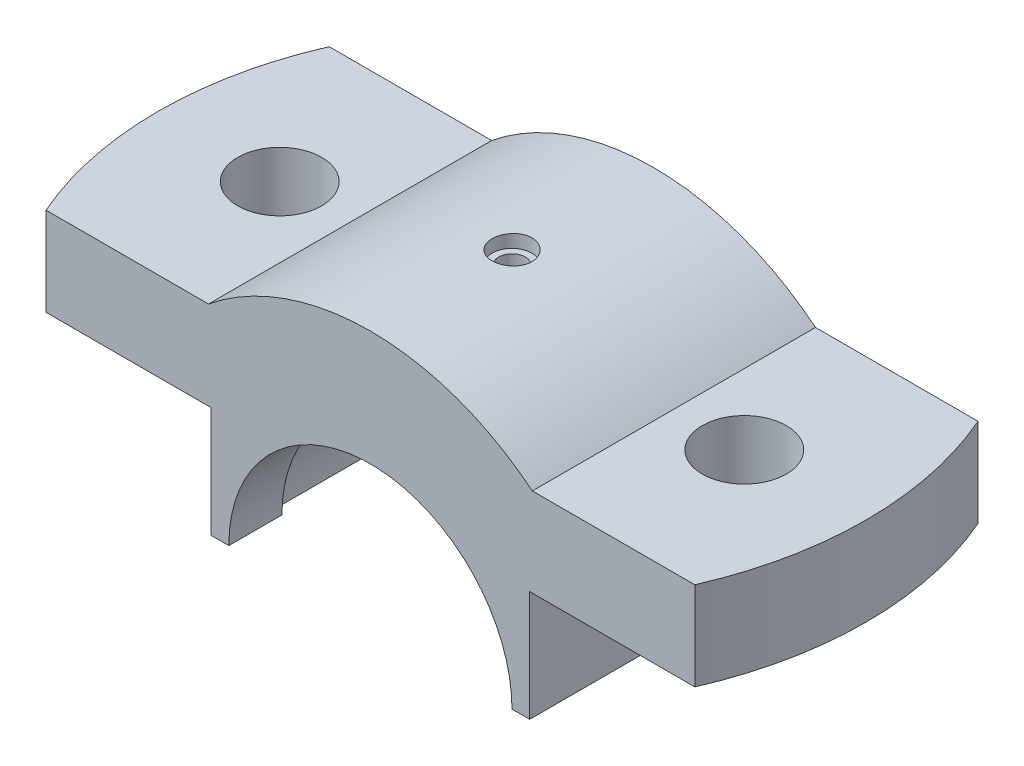
ISO-10303-21;
HEADER;
FILE_DESCRIPTION(('STEP AP214'),'2;1');
FILE_NAME('part.step','',(''),(''),'','','');
FILE_SCHEMA(('AUTOMOTIVE_DESIGN { 1 0 10303 214 1 1 1 1 }'));
ENDSEC;
DATA;
#1=APPLICATION_CONTEXT('core data for automotive mechanical design processes');
#2=APPLICATION_PROTOCOL_DEFINITION('international standard','automotive_design',2000,#1);
#3=PRODUCT_CONTEXT('',#1,'mechanical');
#4=PRODUCT('Part','Part','',(#3));
#5=PRODUCT_RELATED_PRODUCT_CATEGORY('part','',(#4));
#6=PRODUCT_DEFINITION_FORMATION('','',#4);
#7=PRODUCT_DEFINITION_CONTEXT('part definition',#1,'design');
#8=PRODUCT_DEFINITION('design','',#6,#7);
#9=PRODUCT_DEFINITION_SHAPE('','',#8);
#10=(LENGTH_UNIT() NAMED_UNIT(*) SI_UNIT(.MILLI.,.METRE.));
#11=(NAMED_UNIT(*) PLANE_ANGLE_UNIT() SI_UNIT($,.RADIAN.));
#12=(NAMED_UNIT(*) SI_UNIT($,.STERADIAN.) SOLID_ANGLE_UNIT());
#13=UNCERTAINTY_MEASURE_WITH_UNIT(LENGTH_MEASURE(1.E-05),#10,'distance_accuracy_value','');
#14=(GEOMETRIC_REPRESENTATION_CONTEXT(3) GLOBAL_UNCERTAINTY_ASSIGNED_CONTEXT((#13)) GLOBAL_UNIT_ASSIGNED_CONTEXT((#10,
#11,#12)) REPRESENTATION_CONTEXT('',''));
#15=CARTESIAN_POINT('',(0.,0.,0.));
#16=DIRECTION('',(0.,0.,1.));
#17=DIRECTION('',(1.,0.,0.));
#18=AXIS2_PLACEMENT_3D('',#15,#16,#17);
#19=CARTESIAN_POINT('',(-80.,45.,32.));
#20=DIRECTION('',(0.,1.,0.));
#21=DIRECTION('',(-1.,0.,0.));
#22=AXIS2_PLACEMENT_3D('',#19,#20,#21);
#23=PLANE('',#22);
#24=CARTESIAN_POINT('',(-52.5,45.,0.));
#25=DIRECTION('',(0.,-1.,0.));
#26=DIRECTION('',(1.,0.,0.));
#27=AXIS2_PLACEMENT_3D('',#24,#25,#26);
#28=CIRCLE('',#27,9.49999999999999);
#29=CARTESIAN_POINT('',(-62.,45.,0.));
#30=VERTEX_POINT('',#29);
#31=EDGE_CURVE('E173',#30,#30,#28,.T.);
#32=ORIENTED_EDGE('',*,*,#31,.T.);
#33=EDGE_LOOP('',(#32));
#34=FACE_BOUND('',#33,.T.);
#35=CARTESIAN_POINT('',(0.,45.,0.));
#36=DIRECTION('',(0.,-1.,0.));
#37=DIRECTION('',(1.,0.,0.));
#38=AXIS2_PLACEMENT_3D('',#35,#36,#37);
#39=CIRCLE('',#38,80.);
#40=CARTESIAN_POINT('',(-73.3212111192935,45.,32.));
#41=VERTEX_POINT('',#40);
#42=CARTESIAN_POINT('',(-73.3212111192935,45.,-32.));
#43=VERTEX_POINT('',#42);
#44=EDGE_CURVE('E154',#41,#43,#39,.T.);
#45=ORIENTED_EDGE('',*,*,#44,.F.);
#46=DIRECTION('',(1.,0.,0.));
#47=VECTOR('',#46,1.);
#48=CARTESIAN_POINT('',(-80.,45.,32.));
#49=LINE('',#48,#47);
#50=CARTESIAN_POINT('',(-36.592348927064,45.,32.));
#51=VERTEX_POINT('',#50);
#52=EDGE_CURVE('E158',#41,#51,#49,.T.);
#53=ORIENTED_EDGE('',*,*,#52,.T.);
#54=DIRECTION('',(0.,0.,-1.));
#55=VECTOR('',#54,1.);
#56=CARTESIAN_POINT('',(-36.592348927064,45.,32.));
#57=LINE('',#56,#55);
#58=CARTESIAN_POINT('',(-36.592348927064,45.,-32.));
#59=VERTEX_POINT('',#58);
#60=EDGE_CURVE('E209',#51,#59,#57,.T.);
#61=ORIENTED_EDGE('',*,*,#60,.T.);
#62=DIRECTION('',(1.,0.,0.));
#63=VECTOR('',#62,1.);
#64=CARTESIAN_POINT('',(-80.,45.,-32.));
#65=LINE('',#64,#63);
#66=EDGE_CURVE('E160',#43,#59,#65,.T.);
#67=ORIENTED_EDGE('',*,*,#66,.F.);
#68=EDGE_LOOP('',(#45,#53,#61,#67));
#69=FACE_BOUND('',#68,.T.);
#70=ADVANCED_FACE('F39',(#34,#69),#23,.T.);
#71=CARTESIAN_POINT('',(-36.,25.,32.));
#72=DIRECTION('',(0.,-1.,0.));
#73=DIRECTION('',(0.,0.,-1.));
#74=AXIS2_PLACEMENT_3D('',#71,#72,#73);
#75=PLANE('',#74);
#76=CARTESIAN_POINT('',(-52.5,25.,0.));
#77=DIRECTION('',(0.,-1.,0.));
#78=DIRECTION('',(0.,0.,-1.));
#79=AXIS2_PLACEMENT_3D('',#76,#77,#78);
#80=CIRCLE('',#79,9.49999999999999);
#81=CARTESIAN_POINT('',(-62.,25.,0.));
#82=VERTEX_POINT('',#81);
#83=EDGE_CURVE('E197',#82,#82,#80,.F.);
#84=ORIENTED_EDGE('',*,*,#83,.T.);
#85=EDGE_LOOP('',(#84));
#86=FACE_BOUND('',#85,.T.);
#87=CARTESIAN_POINT('',(0.,25.,0.));
#88=DIRECTION('',(0.,-1.,0.));
#89=DIRECTION('',(0.,0.,-1.));
#90=AXIS2_PLACEMENT_3D('',#87,#88,#89);
#91=CIRCLE('',#90,80.);
#92=CARTESIAN_POINT('',(-73.3212111192935,25.,-32.));
#93=VERTEX_POINT('',#92);
#94=CARTESIAN_POINT('',(-73.3212111192935,25.,32.));
#95=VERTEX_POINT('',#94);
#96=EDGE_CURVE('E48',#93,#95,#91,.F.);
#97=ORIENTED_EDGE('',*,*,#96,.F.);
#98=DIRECTION('',(-1.,0.,0.));
#99=VECTOR('',#98,1.);
#100=CARTESIAN_POINT('',(-36.,25.,-32.));
#101=LINE('',#100,#99);
#102=CARTESIAN_POINT('',(-36.,25.,-32.));
#103=VERTEX_POINT('',#102);
#104=EDGE_CURVE('E196',#103,#93,#101,.T.);
#105=ORIENTED_EDGE('',*,*,#104,.F.);
#106=DIRECTION('',(0.,0.,-1.));
#107=VECTOR('',#106,1.);
#108=CARTESIAN_POINT('',(-36.,25.,32.));
#109=LINE('',#108,#107);
#110=CARTESIAN_POINT('',(-36.,25.,32.));
#111=VERTEX_POINT('',#110);
#112=EDGE_CURVE('E207',#111,#103,#109,.T.);
#113=ORIENTED_EDGE('',*,*,#112,.F.);
#114=DIRECTION('',(-1.,0.,0.));
#115=VECTOR('',#114,1.);
#116=CARTESIAN_POINT('',(-36.,25.,32.));
#117=LINE('',#116,#115);
#118=EDGE_CURVE('E179',#111,#95,#117,.T.);
#119=ORIENTED_EDGE('',*,*,#118,.T.);
#120=EDGE_LOOP('',(#97,#105,#113,#119));
#121=FACE_BOUND('',#120,.T.);
#122=ADVANCED_FACE('F325',(#86,#121),#75,.T.);
#123=CARTESIAN_POINT('',(0.,0.,32.));
#124=DIRECTION('',(0.,0.,-1.));
#125=DIRECTION('',(-1.,0.,0.));
#126=AXIS2_PLACEMENT_3D('',#123,#124,#125);
#127=CYLINDRICAL_SURFACE('',#126,32.);
#128=CARTESIAN_POINT('',(0.,0.,-20.));
#129=DIRECTION('',(0.,0.,1.));
#130=DIRECTION('',(1.,0.,0.));
#131=AXIS2_PLACEMENT_3D('',#128,#129,#130);
#132=CIRCLE('',#131,32.);
#133=CARTESIAN_POINT('',(-32.,0.,-20.));
#134=VERTEX_POINT('',#133);
#135=CARTESIAN_POINT('',(32.,0.,-20.));
#136=VERTEX_POINT('',#135);
#137=EDGE_CURVE('E225',#134,#136,#132,.F.);
#138=ORIENTED_EDGE('',*,*,#137,.F.);
#139=DIRECTION('',(0.,0.,-1.));
#140=VECTOR('',#139,1.);
#141=CARTESIAN_POINT('',(-32.,0.,32.));
#142=LINE('',#141,#140);
#143=CARTESIAN_POINT('',(-32.,0.,-32.));
#144=VERTEX_POINT('',#143);
#145=EDGE_CURVE('E194',#134,#144,#142,.T.);
#146=ORIENTED_EDGE('',*,*,#145,.T.);
#147=CARTESIAN_POINT('',(0.,0.,-32.));
#148=DIRECTION('',(0.,0.,-1.));
#149=DIRECTION('',(1.,0.,0.));
#150=AXIS2_PLACEMENT_3D('',#147,#148,#149);
#151=CIRCLE('',#150,32.);
#152=CARTESIAN_POINT('',(32.,0.,-32.));
#153=VERTEX_POINT('',#152);
#154=EDGE_CURVE('E238',#144,#153,#151,.T.);
#155=ORIENTED_EDGE('',*,*,#154,.T.);
#156=DIRECTION('',(0.,0.,-1.));
#157=VECTOR('',#156,1.);
#158=CARTESIAN_POINT('',(32.,0.,32.));
#159=LINE('',#158,#157);
#160=EDGE_CURVE('E275',#136,#153,#159,.T.);
#161=ORIENTED_EDGE('',*,*,#160,.F.);
#162=EDGE_LOOP('',(#138,#146,#155,#161));
#163=FACE_BOUND('',#162,.T.);
#164=ADVANCED_FACE('F319',(#163),#127,.F.);
#165=CARTESIAN_POINT('',(-32.,0.,32.));
#166=DIRECTION('',(0.,-1.,0.));
#167=DIRECTION('',(0.,0.,-1.));
#168=AXIS2_PLACEMENT_3D('',#165,#166,#167);
#169=PLANE('',#168);
#170=ORIENTED_EDGE('',*,*,#145,.F.);
#171=DIRECTION('',(-1.,0.,0.));
#172=VECTOR('',#171,1.);
#173=CARTESIAN_POINT('',(-32.,0.,-20.));
#174=LINE('',#173,#172);
#175=CARTESIAN_POINT('',(-34.,0.,-20.));
#176=VERTEX_POINT('',#175);
#177=EDGE_CURVE('E288',#134,#176,#174,.T.);
#178=ORIENTED_EDGE('',*,*,#177,.T.);
#179=DIRECTION('',(0.,0.,1.));
#180=VECTOR('',#179,1.);
#181=CARTESIAN_POINT('',(-34.,0.,-20.));
#182=LINE('',#181,#180);
#183=CARTESIAN_POINT('',(-34.,0.,20.));
#184=VERTEX_POINT('',#183);
#185=EDGE_CURVE('E285',#176,#184,#182,.T.);
#186=ORIENTED_EDGE('',*,*,#185,.T.);
#187=DIRECTION('',(-1.,0.,0.));
#188=VECTOR('',#187,1.);
#189=CARTESIAN_POINT('',(-32.,0.,20.));
#190=LINE('',#189,#188);
#191=CARTESIAN_POINT('',(-32.,0.,20.));
#192=VERTEX_POINT('',#191);
#193=EDGE_CURVE('E281',#192,#184,#190,.T.);
#194=ORIENTED_EDGE('',*,*,#193,.F.);
#195=CARTESIAN_POINT('',(-32.,0.,32.));
#196=VERTEX_POINT('',#195);
#197=EDGE_CURVE('E202',#196,#192,#142,.T.);
#198=ORIENTED_EDGE('',*,*,#197,.F.);
#199=DIRECTION('',(-1.,0.,0.));
#200=VECTOR('',#199,1.);
#201=CARTESIAN_POINT('',(-32.,0.,32.));
#202=LINE('',#201,#200);
#203=CARTESIAN_POINT('',(-36.,0.,32.));
#204=VERTEX_POINT('',#203);
#205=EDGE_CURVE('E191',#196,#204,#202,.T.);
#206=ORIENTED_EDGE('',*,*,#205,.T.);
#207=DIRECTION('',(0.,0.,-1.));
#208=VECTOR('',#207,1.);
#209=CARTESIAN_POINT('',(-36.,0.,32.));
#210=LINE('',#209,#208);
#211=CARTESIAN_POINT('',(-36.,0.,-32.));
#212=VERTEX_POINT('',#211);
#213=EDGE_CURVE('E205',#204,#212,#210,.T.);
#214=ORIENTED_EDGE('',*,*,#213,.T.);
#215=DIRECTION('',(-1.,0.,0.));
#216=VECTOR('',#215,1.);
#217=CARTESIAN_POINT('',(-32.,0.,-32.));
#218=LINE('',#217,#216);
#219=EDGE_CURVE('E180',#144,#212,#218,.T.);
#220=ORIENTED_EDGE('',*,*,#219,.F.);
#221=EDGE_LOOP('',(#170,#178,#186,#194,#198,#206,#214,#220));
#222=FACE_BOUND('',#221,.T.);
#223=ADVANCED_FACE('F315',(#222),#169,.T.);
#224=CARTESIAN_POINT('',(36.,25.,32.));
#225=DIRECTION('',(0.,1.,0.));
#226=DIRECTION('',(0.,0.,1.));
#227=AXIS2_PLACEMENT_3D('',#224,#225,#226);
#228=PLANE('',#227);
#229=CARTESIAN_POINT('',(52.5,25.,0.));
#230=DIRECTION('',(0.,1.,0.));
#231=DIRECTION('',(0.,0.,1.));
#232=AXIS2_PLACEMENT_3D('',#229,#230,#231);
#233=CIRCLE('',#232,9.49999999999999);
#234=CARTESIAN_POINT('',(43.,25.,0.));
#235=VERTEX_POINT('',#234);
#236=EDGE_CURVE('E235',#235,#235,#233,.T.);
#237=ORIENTED_EDGE('',*,*,#236,.T.);
#238=EDGE_LOOP('',(#237));
#239=FACE_BOUND('',#238,.T.);
#240=CARTESIAN_POINT('',(0.,25.,0.));
#241=DIRECTION('',(0.,1.,0.));
#242=DIRECTION('',(0.,0.,1.));
#243=AXIS2_PLACEMENT_3D('',#240,#241,#242);
#244=CIRCLE('',#243,80.);
#245=CARTESIAN_POINT('',(73.3212111192935,25.,32.));
#246=VERTEX_POINT('',#245);
#247=CARTESIAN_POINT('',(73.3212111192935,25.,-32.));
#248=VERTEX_POINT('',#247);
#249=EDGE_CURVE('E63',#246,#248,#244,.T.);
#250=ORIENTED_EDGE('',*,*,#249,.F.);
#251=DIRECTION('',(1.,0.,0.));
#252=VECTOR('',#251,1.);
#253=CARTESIAN_POINT('',(36.,25.,32.));
#254=LINE('',#253,#252);
#255=CARTESIAN_POINT('',(36.,25.,32.));
#256=VERTEX_POINT('',#255);
#257=EDGE_CURVE('E247',#256,#246,#254,.T.);
#258=ORIENTED_EDGE('',*,*,#257,.F.);
#259=DIRECTION('',(0.,0.,-1.));
#260=VECTOR('',#259,1.);
#261=CARTESIAN_POINT('',(36.,25.,32.));
#262=LINE('',#261,#260);
#263=CARTESIAN_POINT('',(36.,25.,-32.));
#264=VERTEX_POINT('',#263);
#265=EDGE_CURVE('E269',#256,#264,#262,.T.);
#266=ORIENTED_EDGE('',*,*,#265,.T.);
#267=DIRECTION('',(1.,0.,0.));
#268=VECTOR('',#267,1.);
#269=CARTESIAN_POINT('',(36.,25.,-32.));
#270=LINE('',#269,#268);
#271=EDGE_CURVE('E260',#264,#248,#270,.T.);
#272=ORIENTED_EDGE('',*,*,#271,.T.);
#273=EDGE_LOOP('',(#250,#258,#266,#272));
#274=FACE_BOUND('',#273,.T.);
#275=ADVANCED_FACE('F318',(#239,#274),#228,.F.);
#276=CARTESIAN_POINT('',(80.,45.,32.));
#277=DIRECTION('',(0.,-1.,0.));
#278=DIRECTION('',(1.,0.,0.));
#279=AXIS2_PLACEMENT_3D('',#276,#277,#278);
#280=PLANE('',#279);
#281=CARTESIAN_POINT('',(52.5,45.,0.));
#282=DIRECTION('',(0.,1.,0.));
#283=DIRECTION('',(-1.,0.,0.));
#284=AXIS2_PLACEMENT_3D('',#281,#282,#283);
#285=CIRCLE('',#284,9.49999999999999);
#286=CARTESIAN_POINT('',(43.,45.,0.));
#287=VERTEX_POINT('',#286);
#288=EDGE_CURVE('E232',#287,#287,#285,.T.);
#289=ORIENTED_EDGE('',*,*,#288,.F.);
#290=EDGE_LOOP('',(#289));
#291=FACE_BOUND('',#290,.T.);
#292=CARTESIAN_POINT('',(0.,45.,0.));
#293=DIRECTION('',(0.,1.,0.));
#294=DIRECTION('',(-1.,0.,0.));
#295=AXIS2_PLACEMENT_3D('',#292,#293,#294);
#296=CIRCLE('',#295,80.);
#297=CARTESIAN_POINT('',(73.3212111192935,45.,32.));
#298=VERTEX_POINT('',#297);
#299=CARTESIAN_POINT('',(73.3212111192935,45.,-32.));
#300=VERTEX_POINT('',#299);
#301=EDGE_CURVE('E211',#298,#300,#296,.T.);
#302=ORIENTED_EDGE('',*,*,#301,.T.);
#303=DIRECTION('',(-1.,0.,0.));
#304=VECTOR('',#303,1.);
#305=CARTESIAN_POINT('',(80.,45.,-32.));
#306=LINE('',#305,#304);
#307=CARTESIAN_POINT('',(36.592348927064,45.,-32.));
#308=VERTEX_POINT('',#307);
#309=EDGE_CURVE('E263',#300,#308,#306,.T.);
#310=ORIENTED_EDGE('',*,*,#309,.T.);
#311=DIRECTION('',(0.,0.,-1.));
#312=VECTOR('',#311,1.);
#313=CARTESIAN_POINT('',(36.592348927064,45.,32.));
#314=LINE('',#313,#312);
#315=CARTESIAN_POINT('',(36.592348927064,45.,32.));
#316=VERTEX_POINT('',#315);
#317=EDGE_CURVE('E253',#316,#308,#314,.T.);
#318=ORIENTED_EDGE('',*,*,#317,.F.);
#319=DIRECTION('',(-1.,0.,0.));
#320=VECTOR('',#319,1.);
#321=CARTESIAN_POINT('',(80.,45.,32.));
#322=LINE('',#321,#320);
#323=EDGE_CURVE('E250',#298,#316,#322,.T.);
#324=ORIENTED_EDGE('',*,*,#323,.F.);
#325=EDGE_LOOP('',(#302,#310,#318,#324));
#326=FACE_BOUND('',#325,.T.);
#327=ADVANCED_FACE('F403',(#291,#326),#280,.F.);
#328=CARTESIAN_POINT('',(0.,0.,32.));
#329=DIRECTION('',(0.,0.,1.));
#330=DIRECTION('',(1.,0.,0.));
#331=AXIS2_PLACEMENT_3D('',#328,#329,#330);
#332=PLANE('',#331);
#333=DIRECTION('',(0.,1.,0.));
#334=VECTOR('',#333,1.);
#335=CARTESIAN_POINT('',(-73.3212111192935,4.99999999999999,32.));
#336=LINE('',#335,#334);
#337=EDGE_CURVE('E168',#95,#41,#336,.T.);
#338=ORIENTED_EDGE('',*,*,#337,.F.);
#339=ORIENTED_EDGE('',*,*,#118,.F.);
#340=DIRECTION('',(0.,1.,0.));
#341=VECTOR('',#340,1.);
#342=CARTESIAN_POINT('',(-36.,0.,32.));
#343=LINE('',#342,#341);
#344=EDGE_CURVE('E182',#204,#111,#343,.T.);
#345=ORIENTED_EDGE('',*,*,#344,.F.);
#346=ORIENTED_EDGE('',*,*,#205,.F.);
#347=CARTESIAN_POINT('',(0.,0.,32.));
#348=DIRECTION('',(0.,0.,-1.));
#349=DIRECTION('',(1.,0.,0.));
#350=AXIS2_PLACEMENT_3D('',#347,#348,#349);
#351=CIRCLE('',#350,32.);
#352=CARTESIAN_POINT('',(32.,0.,32.));
#353=VERTEX_POINT('',#352);
#354=EDGE_CURVE('E239',#196,#353,#351,.T.);
#355=ORIENTED_EDGE('',*,*,#354,.T.);
#356=DIRECTION('',(1.,0.,0.));
#357=VECTOR('',#356,1.);
#358=CARTESIAN_POINT('',(32.,0.,32.));
#359=LINE('',#358,#357);
#360=CARTESIAN_POINT('',(36.,0.,32.));
#361=VERTEX_POINT('',#360);
#362=EDGE_CURVE('E242',#353,#361,#359,.T.);
#363=ORIENTED_EDGE('',*,*,#362,.T.);
#364=DIRECTION('',(0.,1.,0.));
#365=VECTOR('',#364,1.);
#366=CARTESIAN_POINT('',(36.,0.,32.));
#367=LINE('',#366,#365);
#368=EDGE_CURVE('E245',#361,#256,#367,.T.);
#369=ORIENTED_EDGE('',*,*,#368,.T.);
#370=ORIENTED_EDGE('',*,*,#257,.T.);
#371=DIRECTION('',(0.,1.,0.));
#372=VECTOR('',#371,1.);
#373=CARTESIAN_POINT('',(73.3212111192935,4.99999999999999,32.));
#374=LINE('',#373,#372);
#375=EDGE_CURVE('E214',#246,#298,#374,.T.);
#376=ORIENTED_EDGE('',*,*,#375,.T.);
#377=ORIENTED_EDGE('',*,*,#323,.T.);
#378=CARTESIAN_POINT('',(0.,0.,32.));
#379=DIRECTION('',(0.,0.,1.));
#380=DIRECTION('',(1.,0.,0.));
#381=AXIS2_PLACEMENT_3D('',#378,#379,#380);
#382=CIRCLE('',#381,58.);
#383=EDGE_CURVE('E177',#316,#51,#382,.T.);
#384=ORIENTED_EDGE('',*,*,#383,.T.);
#385=ORIENTED_EDGE('',*,*,#52,.F.);
#386=EDGE_LOOP('',(#338,#339,#345,#346,#355,#363,#369,#370,#376,#377,#384,#385));
#387=FACE_BOUND('',#386,.T.);
#388=ADVANCED_FACE('F175',(#387),#332,.T.);
#389=CARTESIAN_POINT('',(0.,0.,-32.));
#390=DIRECTION('',(0.,0.,1.));
#391=DIRECTION('',(1.,0.,0.));
#392=AXIS2_PLACEMENT_3D('',#389,#390,#391);
#393=PLANE('',#392);
#394=ORIENTED_EDGE('',*,*,#104,.T.);
#395=DIRECTION('',(0.,1.,0.));
#396=VECTOR('',#395,1.);
#397=CARTESIAN_POINT('',(-73.3212111192935,4.99999999999999,-32.));
#398=LINE('',#397,#396);
#399=EDGE_CURVE('E164',#93,#43,#398,.T.);
#400=ORIENTED_EDGE('',*,*,#399,.T.);
#401=ORIENTED_EDGE('',*,*,#66,.T.);
#402=CARTESIAN_POINT('',(0.,0.,-32.));
#403=DIRECTION('',(0.,0.,1.));
#404=DIRECTION('',(1.,0.,0.));
#405=AXIS2_PLACEMENT_3D('',#402,#403,#404);
#406=CIRCLE('',#405,58.);
#407=EDGE_CURVE('E243',#308,#59,#406,.T.);
#408=ORIENTED_EDGE('',*,*,#407,.F.);
#409=ORIENTED_EDGE('',*,*,#309,.F.);
#410=DIRECTION('',(0.,1.,0.));
#411=VECTOR('',#410,1.);
#412=CARTESIAN_POINT('',(73.3212111192935,4.99999999999999,-32.));
#413=LINE('',#412,#411);
#414=EDGE_CURVE('E279',#248,#300,#413,.T.);
#415=ORIENTED_EDGE('',*,*,#414,.F.);
#416=ORIENTED_EDGE('',*,*,#271,.F.);
#417=DIRECTION('',(0.,1.,0.));
#418=VECTOR('',#417,1.);
#419=CARTESIAN_POINT('',(36.,0.,-32.));
#420=LINE('',#419,#418);
#421=CARTESIAN_POINT('',(36.,0.,-32.));
#422=VERTEX_POINT('',#421);
#423=EDGE_CURVE('E258',#422,#264,#420,.T.);
#424=ORIENTED_EDGE('',*,*,#423,.F.);
#425=DIRECTION('',(1.,0.,0.));
#426=VECTOR('',#425,1.);
#427=CARTESIAN_POINT('',(32.,0.,-32.));
#428=LINE('',#427,#426);
#429=EDGE_CURVE('E256',#153,#422,#428,.T.);
#430=ORIENTED_EDGE('',*,*,#429,.F.);
#431=ORIENTED_EDGE('',*,*,#154,.F.);
#432=ORIENTED_EDGE('',*,*,#219,.T.);
#433=DIRECTION('',(0.,1.,0.));
#434=VECTOR('',#433,1.);
#435=CARTESIAN_POINT('',(-36.,0.,-32.));
#436=LINE('',#435,#434);
#437=EDGE_CURVE('E185',#212,#103,#436,.T.);
#438=ORIENTED_EDGE('',*,*,#437,.T.);
#439=EDGE_LOOP('',(#394,#400,#401,#408,#409,#415,#416,#424,#430,#431,#432,#438));
#440=FACE_BOUND('',#439,.T.);
#441=ADVANCED_FACE('F387',(#440),#393,.F.);
#442=CARTESIAN_POINT('',(32.,0.,32.));
#443=DIRECTION('',(0.,1.,0.));
#444=DIRECTION('',(0.,0.,1.));
#445=AXIS2_PLACEMENT_3D('',#442,#443,#444);
#446=PLANE('',#445);
#447=DIRECTION('',(1.,0.,0.));
#448=VECTOR('',#447,1.);
#449=CARTESIAN_POINT('',(32.,0.,-20.));
#450=LINE('',#449,#448);
#451=CARTESIAN_POINT('',(34.,0.,-20.));
#452=VERTEX_POINT('',#451);
#453=EDGE_CURVE('E227',#136,#452,#450,.T.);
#454=ORIENTED_EDGE('',*,*,#453,.F.);
#455=ORIENTED_EDGE('',*,*,#160,.T.);
#456=ORIENTED_EDGE('',*,*,#429,.T.);
#457=DIRECTION('',(0.,0.,-1.));
#458=VECTOR('',#457,1.);
#459=CARTESIAN_POINT('',(36.,0.,32.));
#460=LINE('',#459,#458);
#461=EDGE_CURVE('E272',#361,#422,#460,.T.);
#462=ORIENTED_EDGE('',*,*,#461,.F.);
#463=ORIENTED_EDGE('',*,*,#362,.F.);
#464=CARTESIAN_POINT('',(32.,0.,20.));
#465=VERTEX_POINT('',#464);
#466=EDGE_CURVE('E276',#353,#465,#159,.T.);
#467=ORIENTED_EDGE('',*,*,#466,.T.);
#468=DIRECTION('',(1.,0.,0.));
#469=VECTOR('',#468,1.);
#470=CARTESIAN_POINT('',(32.,0.,20.));
#471=LINE('',#470,#469);
#472=CARTESIAN_POINT('',(34.,0.,20.));
#473=VERTEX_POINT('',#472);
#474=EDGE_CURVE('E222',#465,#473,#471,.T.);
#475=ORIENTED_EDGE('',*,*,#474,.T.);
#476=DIRECTION('',(0.,0.,1.));
#477=VECTOR('',#476,1.);
#478=CARTESIAN_POINT('',(34.,0.,-20.));
#479=LINE('',#478,#477);
#480=EDGE_CURVE('E229',#473,#452,#479,.F.);
#481=ORIENTED_EDGE('',*,*,#480,.T.);
#482=EDGE_LOOP('',(#454,#455,#456,#462,#463,#467,#475,#481));
#483=FACE_BOUND('',#482,.T.);
#484=ADVANCED_FACE('F377',(#483),#446,.F.);
#485=ORIENTED_EDGE('',*,*,#197,.T.);
#486=CARTESIAN_POINT('',(0.,0.,20.));
#487=DIRECTION('',(0.,0.,1.));
#488=DIRECTION('',(1.,0.,0.));
#489=AXIS2_PLACEMENT_3D('',#486,#487,#488);
#490=CIRCLE('',#489,32.);
#491=EDGE_CURVE('E55',#192,#465,#490,.F.);
#492=ORIENTED_EDGE('',*,*,#491,.T.);
#493=ORIENTED_EDGE('',*,*,#466,.F.);
#494=ORIENTED_EDGE('',*,*,#354,.F.);
#495=EDGE_LOOP('',(#485,#492,#493,#494));
#496=FACE_BOUND('',#495,.T.);
#497=ADVANCED_FACE('F41',(#496),#127,.F.);
#498=CARTESIAN_POINT('',(36.,0.,32.));
#499=DIRECTION('',(-1.,0.,0.));
#500=DIRECTION('',(0.,0.,1.));
#501=AXIS2_PLACEMENT_3D('',#498,#499,#500);
#502=PLANE('',#501);
#503=ORIENTED_EDGE('',*,*,#423,.T.);
#504=ORIENTED_EDGE('',*,*,#265,.F.);
#505=ORIENTED_EDGE('',*,*,#368,.F.);
#506=ORIENTED_EDGE('',*,*,#461,.T.);
#507=EDGE_LOOP('',(#503,#504,#505,#506));
#508=FACE_BOUND('',#507,.T.);
#509=ADVANCED_FACE('F394',(#508),#502,.F.);
#510=CARTESIAN_POINT('',(0.,0.,32.));
#511=DIRECTION('',(0.,0.,-1.));
#512=DIRECTION('',(-1.,0.,0.));
#513=AXIS2_PLACEMENT_3D('',#510,#511,#512);
#514=CYLINDRICAL_SURFACE('',#513,58.);
#515=CARTESIAN_POINT('',(0.,58.,4.5));
#516=CARTESIAN_POINT('',(-0.252359793738716,57.9999977024869,4.49998895149198));
#517=CARTESIAN_POINT('',(-0.504892877748838,57.9983353868443,4.47870012675714));
#518=CARTESIAN_POINT('',(-1.00297624718818,57.9918639022051,4.394085847153));
#519=CARTESIAN_POINT('',(-1.24851822116363,57.9870511384464,4.33071237115408));
#520=CARTESIAN_POINT('',(-1.72533318797732,57.9748228021003,4.1637686515525));
#521=CARTESIAN_POINT('',(-1.95661400645151,57.9674086721973,4.06022068484791));
#522=CARTESIAN_POINT('',(-2.39845512226942,57.9508097960598,3.81590608418857));
#523=CARTESIAN_POINT('',(-2.60901993307496,57.9416254368068,3.67514758216075));
#524=CARTESIAN_POINT('',(-3.00397818955957,57.9224943436521,3.36006757509697));
#525=CARTESIAN_POINT('',(-3.18831914222795,57.9125461403362,3.18568035267479));
#526=CARTESIAN_POINT('',(-3.52514686919044,57.8930209719266,2.80843126738806));
#527=CARTESIAN_POINT('',(-3.67763226544261,57.8834440229076,2.60556817331805));
#528=CARTESIAN_POINT('',(-3.94659447428022,57.8657294809476,2.17681268952154));
#529=CARTESIAN_POINT('',(-4.0630257294039,57.8575937145703,1.95089163925183));
#530=CARTESIAN_POINT('',(-4.25628349282916,57.8436988198718,1.48263338103564));
#531=CARTESIAN_POINT('',(-4.3331106169984,57.8379396545934,1.24029642843245));
#532=CARTESIAN_POINT('',(-4.44482849556627,57.8294619104682,0.746606991705949));
#533=CARTESIAN_POINT('',(-4.47980405636619,57.8267371835316,0.495273805876399));
#534=CARTESIAN_POINT('',(-4.50708791735635,57.824617208741,-0.00970954370026452));
#535=CARTESIAN_POINT('',(-4.49939692150447,57.8252219059546,-0.263359669151128));
#536=CARTESIAN_POINT('',(-4.44163615126731,57.8296868860352,-0.765196544542829));
#537=CARTESIAN_POINT('',(-4.39165842031324,57.8335400979564,-1.0133939602512));
#538=CARTESIAN_POINT('',(-4.25088579414002,57.844056823805,-1.4978665800448));
#539=CARTESIAN_POINT('',(-4.16009054693695,57.8507203619668,-1.73414168130014));
#540=CARTESIAN_POINT('',(-3.94015673685419,57.8661150329905,-2.18835675949468));
#541=CARTESIAN_POINT('',(-3.81097673889048,57.8748483980905,-2.40627659458038));
#542=CARTESIAN_POINT('',(-3.51797028347065,57.8933965380732,-2.81737495807009));
#543=CARTESIAN_POINT('',(-3.35414321920513,57.9032113318947,-3.01055305305161));
#544=CARTESIAN_POINT('',(-2.99597617866389,57.9228478406867,-3.3672196044876));
#545=CARTESIAN_POINT('',(-2.80155660427876,57.9326695052421,-3.53062814142248));
#546=CARTESIAN_POINT('',(-2.38800150253793,57.9511882433069,-3.82249953705383));
#547=CARTESIAN_POINT('',(-2.16886596140897,57.9598853161897,-3.95096237627627));
#548=CARTESIAN_POINT('',(-1.71204848243429,57.9751762617009,-4.16929027248957));
#549=CARTESIAN_POINT('',(-1.47436492088709,57.9817699499404,-4.25915194582917));
#550=CARTESIAN_POINT('',(-0.98722153406252,57.9921089717121,-4.39767149726495));
#551=CARTESIAN_POINT('',(-0.73776192070997,57.9958543564822,-4.44633011656358));
#552=CARTESIAN_POINT('',(-0.234840603025331,58.0000681788799,-4.50096247720365));
#553=CARTESIAN_POINT('',(0.0186090382077802,58.0005450936143,-4.50704664055553));
#554=CARTESIAN_POINT('',(0.522924875415357,57.9981908521738,-4.47664642078674));
#555=CARTESIAN_POINT('',(0.773791092218501,57.9953597226909,-4.44016238114073));
#556=CARTESIAN_POINT('',(1.2655052156016,57.9867133341827,-4.32575289684145));
#557=CARTESIAN_POINT('',(1.50636506425927,57.980901749631,-4.24787847630022));
#558=CARTESIAN_POINT('',(1.9715988464284,57.9669475924391,-4.052950821789));
#559=CARTESIAN_POINT('',(2.19597255301964,57.9588049877217,-3.9358970486658));
#560=CARTESIAN_POINT('',(2.62236838217898,57.9410810825393,-3.66565482564646));
#561=CARTESIAN_POINT('',(2.82434390411551,57.9314968768143,-3.51239304141038));
#562=CARTESIAN_POINT('',(3.19974000882071,57.9119768843392,-3.17419151349931));
#563=CARTESIAN_POINT('',(3.37316016130336,57.902041092294,-2.98925129256409));
#564=CARTESIAN_POINT('',(3.68690010650257,57.882912806946,-2.59246433095048));
#565=CARTESIAN_POINT('',(3.82714796932439,57.8737219567924,-2.38056062508174));
#566=CARTESIAN_POINT('',(4.07006938426786,57.8571466917357,-1.93614622970355));
#567=CARTESIAN_POINT('',(4.17274326844852,57.8497622608685,-1.7036357223287));
#568=CARTESIAN_POINT('',(4.33747903959504,57.8376446431209,-1.22486497714104));
#569=CARTESIAN_POINT('',(4.39958533491597,57.8329085579813,-0.978620095721347));
#570=CARTESIAN_POINT('',(4.48156768357074,57.8266138393227,-0.479159401426049));
#571=CARTESIAN_POINT('',(4.50144442797404,57.8250551538069,-0.225943702693734));
#572=CARTESIAN_POINT('',(4.49839591367522,57.8252923330961,0.279555870314352));
#573=CARTESIAN_POINT('',(4.47558368780448,57.8270793391086,0.531840438138524));
#574=CARTESIAN_POINT('',(4.38804008017121,57.8337877412974,1.02898424765399));
#575=CARTESIAN_POINT('',(4.32330863031605,57.838709142565,1.27384347728306));
#576=CARTESIAN_POINT('',(4.15379182523698,57.8511295117891,1.74919603063243));
#577=CARTESIAN_POINT('',(4.049008076016,57.858628376394,1.97968992993773));
#578=CARTESIAN_POINT('',(3.80237434551184,57.8753588277808,2.41983209761419));
#579=CARTESIAN_POINT('',(3.66052506052397,57.8845903820123,2.62948075747186));
#580=CARTESIAN_POINT('',(3.34336304478355,57.9037749713817,3.02255885882117));
#581=CARTESIAN_POINT('',(3.16796698784695,57.9137297639477,3.20592098056459));
#582=CARTESIAN_POINT('',(2.78883384533331,57.9332232551004,3.54067251785741));
#583=CARTESIAN_POINT('',(2.58508989000051,57.9427618520891,3.69205416087925));
#584=CARTESIAN_POINT('',(2.15470148172562,57.960363117751,3.95872214074536));
#585=CARTESIAN_POINT('',(1.92801939051684,57.9684232975556,4.07394783774998));
#586=CARTESIAN_POINT('',(1.45862107443394,57.9821293828967,4.26455722051526));
#587=CARTESIAN_POINT('',(1.21592375404454,57.9877780781262,4.33998696764161));
#588=CARTESIAN_POINT('',(0.809815132560339,57.9945654167356,4.4295323862987));
#589=CARTESIAN_POINT('',(0.649019848087662,57.9965941751947,4.45592291033908));
#590=CARTESIAN_POINT('',(0.325507075731479,57.9993122063488,4.49116026099405));
#591=CARTESIAN_POINT('',(0.162789592170797,58.0000014820555,4.50000712705494));
#592=CARTESIAN_POINT('',(0.,58.,4.5));
#593=B_SPLINE_CURVE_WITH_KNOTS('',3,(#515,#516,#517,#518,#519,#520,#521,#522,#523,#524,#525,
#526,#527,#528,#529,#530,#531,#532,#533,#534,#535,#536,#537,#538,#539,#540,#541,#542,#543,#544,
#545,#546,#547,#548,#549,#550,#551,#552,#553,#554,#555,#556,#557,#558,#559,#560,#561,#562,#563,
#564,#565,#566,#567,#568,#569,#570,#571,#572,#573,#574,#575,#576,#577,#578,#579,#580,#581,#582,
#583,#584,#585,#586,#587,#588,#589,#590,#591,#592),.UNSPECIFIED.,.T.,.F.,(4,2,2,2,2,2,2,2,2,2,2,
2,2,2,2,2,2,2,2,2,2,2,2,2,2,2,2,2,2,2,2,2,2,2,2,2,2,2,4),(0.,0.756485046403258,1.51383477456704,
2.27076514843294,3.02753024057794,3.7857894738022,4.54408150183091,5.30332782265448,
6.0625623363925,6.82025574693222,7.57793665628365,8.33397258940393,9.09001504221488,
9.84687660147222,10.603751417516,11.3626291272723,12.1215072599239,12.8804518997693,
13.6393828866563,14.3963447620535,15.153300529713,15.9093253149168,16.6653605043238,
17.4229402685355,18.1805314472784,18.9397506073719,19.6989630577246,20.457343017598,
21.2157105667958,21.9720729337891,22.7284365294033,23.4847697997986,24.2410888631023,
24.9993115202263,25.7577182441312,26.5173902327104,27.276181007919,27.7641674944249,
28.2521528837092),.UNSPECIFIED.);
#594=CARTESIAN_POINT('',(0.,58.,4.5));
#595=VERTEX_POINT('',#594);
#596=EDGE_CURVE('E12',#595,#595,#593,.T.);
#597=ORIENTED_EDGE('',*,*,#596,.T.);
#598=EDGE_LOOP('',(#597));
#599=FACE_BOUND('',#598,.T.);
#600=ORIENTED_EDGE('',*,*,#407,.T.);
#601=ORIENTED_EDGE('',*,*,#60,.F.);
#602=ORIENTED_EDGE('',*,*,#383,.F.);
#603=ORIENTED_EDGE('',*,*,#317,.T.);
#604=EDGE_LOOP('',(#600,#601,#602,#603));
#605=FACE_BOUND('',#604,.T.);
#606=ADVANCED_FACE('F296',(#599,#605),#514,.T.);
#607=CARTESIAN_POINT('',(52.5,0.,0.));
#608=DIRECTION('',(0.,1.,0.));
#609=DIRECTION('',(-1.,0.,0.));
#610=AXIS2_PLACEMENT_3D('',#607,#608,#609);
#611=CYLINDRICAL_SURFACE('',#610,9.49999999999999);
#612=CARTESIAN_POINT('',(43.,45.,0.));
#613=CARTESIAN_POINT('',(43.,44.7916666666666,0.));
#614=CARTESIAN_POINT('',(43.,44.5833333333333,0.));
#615=CARTESIAN_POINT('',(43.,44.1666666666666,0.));
#616=CARTESIAN_POINT('',(43.,43.9583333333333,0.));
#617=CARTESIAN_POINT('',(43.,43.5416666666666,0.));
#618=CARTESIAN_POINT('',(43.,43.3333333333333,0.));
#619=CARTESIAN_POINT('',(43.,42.9166666666667,0.));
#620=CARTESIAN_POINT('',(43.,42.7083333333333,0.));
#621=CARTESIAN_POINT('',(43.,42.2916666666667,0.));
#622=CARTESIAN_POINT('',(43.,42.0833333333333,0.));
#623=CARTESIAN_POINT('',(43.,41.6666666666667,0.));
#624=CARTESIAN_POINT('',(43.,41.4583333333333,0.));
#625=CARTESIAN_POINT('',(43.,41.0416666666667,0.));
#626=CARTESIAN_POINT('',(43.,40.8333333333333,0.));
#627=CARTESIAN_POINT('',(43.,40.4166666666667,0.));
#628=CARTESIAN_POINT('',(43.,40.2083333333333,0.));
#629=CARTESIAN_POINT('',(43.,39.7916666666667,0.));
#630=CARTESIAN_POINT('',(43.,39.5833333333333,0.));
#631=CARTESIAN_POINT('',(43.,39.1666666666667,0.));
#632=CARTESIAN_POINT('',(43.,38.9583333333333,0.));
#633=CARTESIAN_POINT('',(43.,38.5416666666667,0.));
#634=CARTESIAN_POINT('',(43.,38.3333333333333,0.));
#635=CARTESIAN_POINT('',(43.,37.9166666666667,0.));
#636=CARTESIAN_POINT('',(43.,37.7083333333333,0.));
#637=CARTESIAN_POINT('',(43.,37.2916666666667,0.));
#638=CARTESIAN_POINT('',(43.,37.0833333333333,0.));
#639=CARTESIAN_POINT('',(43.,36.6666666666667,0.));
#640=CARTESIAN_POINT('',(43.,36.4583333333333,0.));
#641=CARTESIAN_POINT('',(43.,36.0416666666667,0.));
#642=CARTESIAN_POINT('',(43.,35.8333333333333,0.));
#643=CARTESIAN_POINT('',(43.,35.4166666666667,0.));
#644=CARTESIAN_POINT('',(43.,35.2083333333333,0.));
#645=CARTESIAN_POINT('',(43.,34.7916666666667,0.));
#646=CARTESIAN_POINT('',(43.,34.5833333333333,0.));
#647=CARTESIAN_POINT('',(43.,34.1666666666667,0.));
#648=CARTESIAN_POINT('',(43.,33.9583333333333,0.));
#649=CARTESIAN_POINT('',(43.,33.5416666666667,0.));
#650=CARTESIAN_POINT('',(43.,33.3333333333333,0.));
#651=CARTESIAN_POINT('',(43.,32.9166666666667,0.));
#652=CARTESIAN_POINT('',(43.,32.7083333333333,0.));
#653=CARTESIAN_POINT('',(43.,32.2916666666667,0.));
#654=CARTESIAN_POINT('',(43.,32.0833333333333,0.));
#655=CARTESIAN_POINT('',(43.,31.6666666666667,0.));
#656=CARTESIAN_POINT('',(43.,31.4583333333333,0.));
#657=CARTESIAN_POINT('',(43.,31.0416666666667,0.));
#658=CARTESIAN_POINT('',(43.,30.8333333333333,0.));
#659=CARTESIAN_POINT('',(43.,30.4166666666667,0.));
#660=CARTESIAN_POINT('',(43.,30.2083333333333,0.));
#661=CARTESIAN_POINT('',(43.,29.7916666666667,0.));
#662=CARTESIAN_POINT('',(43.,29.5833333333333,0.));
#663=CARTESIAN_POINT('',(43.,29.1666666666667,0.));
#664=CARTESIAN_POINT('',(43.,28.9583333333333,0.));
#665=CARTESIAN_POINT('',(43.,28.5416666666667,0.));
#666=CARTESIAN_POINT('',(43.,28.3333333333333,0.));
#667=CARTESIAN_POINT('',(43.,27.9166666666667,0.));
#668=CARTESIAN_POINT('',(43.,27.7083333333333,0.));
#669=CARTESIAN_POINT('',(43.,27.2916666666667,0.));
#670=CARTESIAN_POINT('',(43.,27.0833333333333,0.));
#671=CARTESIAN_POINT('',(43.,26.6666666666667,0.));
#672=CARTESIAN_POINT('',(43.,26.4583333333333,0.));
#673=CARTESIAN_POINT('',(43.,26.0416666666667,0.));
#674=CARTESIAN_POINT('',(43.,25.8333333333333,0.));
#675=CARTESIAN_POINT('',(43.,25.4166666666667,0.));
#676=CARTESIAN_POINT('',(43.,25.2083333333333,0.));
#677=CARTESIAN_POINT('',(43.,25.,0.));
#678=B_SPLINE_CURVE_WITH_KNOTS('',3,(#612,#613,#614,#615,#616,#617,#618,#619,#620,#621,#622,
#623,#624,#625,#626,#627,#628,#629,#630,#631,#632,#633,#634,#635,#636,#637,#638,#639,#640,#641,
#642,#643,#644,#645,#646,#647,#648,#649,#650,#651,#652,#653,#654,#655,#656,#657,#658,#659,#660,
#661,#662,#663,#664,#665,#666,#667,#668,#669,#670,#671,#672,#673,#674,#675,#676,#677),
.UNSPECIFIED.,.F.,.F.,(4,2,2,2,2,2,2,2,2,2,2,2,2,2,2,2,2,2,2,2,2,2,2,2,2,2,2,2,2,2,2,2,4),(0.,
0.625000000000001,1.25,1.87499999999999,2.5,3.125,3.75,4.375,4.99999999999999,5.62499999999999,
6.24999999999999,6.87499999999999,7.49999999999999,8.12499999999999,8.74999999999999,
9.37499999999999,9.99999999999999,10.625,11.25,11.875,12.5,13.125,13.75,14.375,15.,15.625,16.25,
16.875,17.5,18.125,18.75,19.375,20.),.UNSPECIFIED.);
#679=EDGE_CURVE('BSEAM345',#287,#235,#678,.T.);
#680=ORIENTED_EDGE('',*,*,#288,.T.);
#681=ORIENTED_EDGE('',*,*,#236,.F.);
#682=ORIENTED_EDGE('',*,*,#679,.T.);
#683=ORIENTED_EDGE('',*,*,#679,.F.);
#684=EDGE_LOOP('',(#680,#682,#681,#683));
#685=FACE_BOUND('',#684,.T.);
#686=ADVANCED_FACE('F345',(#685),#611,.F.);
#687=CARTESIAN_POINT('',(0.,0.,-20.));
#688=DIRECTION('',(0.,0.,1.));
#689=DIRECTION('',(1.,0.,0.));
#690=AXIS2_PLACEMENT_3D('',#687,#688,#689);
#691=CYLINDRICAL_SURFACE('',#690,34.);
#692=CARTESIAN_POINT('',(0.,34.,3.));
#693=CARTESIAN_POINT('',(0.168160471733,33.9999982733384,2.99999267162729));
#694=CARTESIAN_POINT('',(0.336434513112336,33.9987391559652,2.98581345630165));
#695=CARTESIAN_POINT('',(0.668324202458538,33.9938373513404,2.92945999687821));
#696=CARTESIAN_POINT('',(0.83193439685284,33.9901919842096,2.88725427682857));
#697=CARTESIAN_POINT('',(1.14964175044432,33.9809295011362,2.77608007626681));
#698=CARTESIAN_POINT('',(1.30374433327118,33.975313521792,2.70712702051663));
#699=CARTESIAN_POINT('',(1.59815239597228,33.9627391097067,2.54444373229384));
#700=CARTESIAN_POINT('',(1.73846076130148,33.9557809586251,2.45071869678303));
#701=CARTESIAN_POINT('',(2.00173175200062,33.9412805405797,2.24086527180837));
#702=CARTESIAN_POINT('',(2.1246497956063,33.9337368464549,2.12468104600596));
#703=CARTESIAN_POINT('',(2.3492682322565,33.918927489695,1.87332564234276));
#704=CARTESIAN_POINT('',(2.45096767996684,33.9116618394591,1.73815361898336));
#705=CARTESIAN_POINT('',(2.63041515367251,33.8982161181173,1.45238686352596));
#706=CARTESIAN_POINT('',(2.70812363624096,33.8920378464261,1.30176720818115));
#707=CARTESIAN_POINT('',(2.83713076092821,33.8814831902194,0.989554172753569));
#708=CARTESIAN_POINT('',(2.88842992048609,33.8771067704005,0.827961007745512));
#709=CARTESIAN_POINT('',(2.96303199454903,33.8706636238234,0.498837263829643));
#710=CARTESIAN_POINT('',(2.98640796403619,33.8685908710134,0.331323364123211));
#711=CARTESIAN_POINT('',(3.00472582700266,33.8669708078465,-0.00526217674140633));
#712=CARTESIAN_POINT('',(2.9996683128491,33.867423444877,-0.1743337853739));
#713=CARTESIAN_POINT('',(2.96132310303998,33.8707975340873,-0.508733970095566));
#714=CARTESIAN_POINT('',(2.92811490466527,33.8737120339064,-0.674071741997371));
#715=CARTESIAN_POINT('',(2.83453454454423,33.8816705667915,-0.996817639603038));
#716=CARTESIAN_POINT('',(2.77416208937135,33.8867146228608,-1.15422567963003));
#717=CARTESIAN_POINT('',(2.62787830628942,33.898371933834,-1.45689661167467));
#718=CARTESIAN_POINT('',(2.54193142085098,33.9049873709143,-1.60214223093812));
#719=CARTESIAN_POINT('',(2.34696410317884,33.9190400867576,-1.87617640817239));
#720=CARTESIAN_POINT('',(2.23794314628571,33.9264773842063,-2.00496459182638));
#721=CARTESIAN_POINT('',(1.99947702625163,33.9413667705549,-2.2428902323973));
#722=CARTESIAN_POINT('',(1.86996315607526,33.9488188228106,-2.35195884036031));
#723=CARTESIAN_POINT('',(1.59442702307016,33.9628738427361,-2.54681658689104));
#724=CARTESIAN_POINT('',(1.44840474737242,33.9694768097441,-2.63260570731126));
#725=CARTESIAN_POINT('',(1.1439512753663,33.9810911808549,-2.77846537442318));
#726=CARTESIAN_POINT('',(0.985518551679902,33.9861023886721,-2.83853274958829));
#727=CARTESIAN_POINT('',(0.660762583881547,33.9939664435021,-2.93119501026013));
#728=CARTESIAN_POINT('',(0.494439523476447,33.9968193407395,-2.96379053504929));
#729=CARTESIAN_POINT('',(0.159220806046201,34.0000388846917,-3.00049722551008));
#730=CARTESIAN_POINT('',(-0.00966436412400411,34.0004138297313,-3.00470346404783));
#731=CARTESIAN_POINT('',(-0.345737406272035,33.9986574108503,-2.98476141869497));
#732=CARTESIAN_POINT('',(-0.512925296011289,33.9965260731844,-2.96061343183025));
#733=CARTESIAN_POINT('',(-0.840585926588066,33.9900020583946,-2.88472722884015));
#734=CARTESIAN_POINT('',(-1.00106898028549,33.9856130036306,-2.83303320378084));
#735=CARTESIAN_POINT('',(-1.31108417299136,33.9750664205978,-2.70356753998221));
#736=CARTESIAN_POINT('',(-1.46061611861524,33.9689088611086,-2.62579544086792));
#737=CARTESIAN_POINT('',(-1.74491632074762,33.9554944272288,-2.44614323929714));
#738=CARTESIAN_POINT('',(-1.87964473087848,33.9482347053581,-2.34420029576195));
#739=CARTESIAN_POINT('',(-2.13011088376827,33.9334407301285,-2.119190781754));
#740=CARTESIAN_POINT('',(-2.24584825639996,33.9259064714224,-1.99612379967833));
#741=CARTESIAN_POINT('',(-2.45537419206312,33.9113879009188,-1.73194643904319));
#742=CARTESIAN_POINT('',(-2.54910061552245,33.9044051821593,-1.59078667623473));
#743=CARTESIAN_POINT('',(-2.71151773150051,33.8918033743594,-1.29467595686));
#744=CARTESIAN_POINT('',(-2.7802086997961,33.8861842702985,-1.13972515223168));
#745=CARTESIAN_POINT('',(-2.89049967125864,33.8769551678615,-0.820648951785537));
#746=CARTESIAN_POINT('',(-2.93213741921713,33.8733423713025,-0.656536686980112));
#747=CARTESIAN_POINT('',(-2.98726278416869,33.8685257848294,-0.323616990877144));
#748=CARTESIAN_POINT('',(-3.00075101476121,33.8673219424052,-0.154809662003263));
#749=CARTESIAN_POINT('',(-2.9991869905993,33.867460436685,0.182090791999533));
#750=CARTESIAN_POINT('',(-2.98423236309713,33.8687940637859,0.350184382527245));
#751=CARTESIAN_POINT('',(-2.92641101179275,33.873838708618,0.681462308385942));
#752=CARTESIAN_POINT('',(-2.88354424818672,33.8775497297393,0.844646636715775));
#753=CARTESIAN_POINT('',(-2.77114081752454,33.886928699679,1.16147818682709));
#754=CARTESIAN_POINT('',(-2.70160622640523,33.8925964961703,1.31512614987831));
#755=CARTESIAN_POINT('',(-2.53785160854039,33.9052506793956,1.60858409496756));
#756=CARTESIAN_POINT('',(-2.44363190023368,33.9122370491197,1.74839425548165));
#757=CARTESIAN_POINT('',(-2.23281456155046,33.9267697862133,2.0107078714938));
#758=CARTESIAN_POINT('',(-2.11614446488993,33.9343179171115,2.13315298956723));
#759=CARTESIAN_POINT('',(-1.86387392652297,33.9491075532346,2.35677502808318));
#760=CARTESIAN_POINT('',(-1.72826892425787,33.9563489840401,2.45794680999078));
#761=CARTESIAN_POINT('',(-1.44168619794504,33.9697239522723,2.63630334945835));
#762=CARTESIAN_POINT('',(-1.29067768885933,33.9758552003034,2.71343877053136));
#763=CARTESIAN_POINT('',(-0.977899462706613,33.9862927788847,2.84115912803824));
#764=CARTESIAN_POINT('',(-0.81614229043078,33.9906011950408,2.8917744235625));
#765=CARTESIAN_POINT('',(-0.544534372379005,33.9958080729784,2.95220105165126));
#766=CARTESIAN_POINT('',(-0.436427616790248,33.9973728416184,2.97010165052798));
#767=CARTESIAN_POINT('',(-0.218896615079336,33.999469365587,2.99400349199971));
#768=CARTESIAN_POINT('',(-0.109472372963124,34.0000011240558,3.00000477076653));
#769=CARTESIAN_POINT('',(0.,34.,3.));
#770=B_SPLINE_CURVE_WITH_KNOTS('',3,(#692,#693,#694,#695,#696,#697,#698,#699,#700,#701,#702,
#703,#704,#705,#706,#707,#708,#709,#710,#711,#712,#713,#714,#715,#716,#717,#718,#719,#720,#721,
#722,#723,#724,#725,#726,#727,#728,#729,#730,#731,#732,#733,#734,#735,#736,#737,#738,#739,#740,
#741,#742,#743,#744,#745,#746,#747,#748,#749,#750,#751,#752,#753,#754,#755,#756,#757,#758,#759,
#760,#761,#762,#763,#764,#765,#766,#767,#768,#769),.UNSPECIFIED.,.T.,.F.,(4,2,2,2,2,2,2,2,2,2,2,
2,2,2,2,2,2,2,2,2,2,2,2,2,2,2,2,2,2,2,2,2,2,2,2,2,2,2,4),(0.,0.504081705514571,1.0087304937551,
1.51308869070499,2.01734116123977,2.52286377498025,3.02840890603613,3.53478291386755,
4.04114699991202,4.54618337186808,5.05120922222047,5.55481361704759,6.05842345190746,
6.56273678102525,7.06706157847743,7.57311453447925,8.07916788497329,8.5852836145878,
9.09138756633432,9.59579578217343,10.1001987141102,10.6037948769995,11.1073999307019,
11.6123289338437,12.1172677766685,12.6236154319859,13.1299575094862,13.6355916102246,
14.1412146891031,14.6451053990316,15.14899682753,15.652849038941,16.156694750962,
16.6621949375081,17.167817086776,17.6744703305833,18.1805423054842,18.5087002111362,
18.8368571192448),.UNSPECIFIED.);
#771=CARTESIAN_POINT('',(0.,34.,3.));
#772=VERTEX_POINT('',#771);
#773=EDGE_CURVE('E349',#772,#772,#770,.T.);
#774=ORIENTED_EDGE('',*,*,#773,.T.);
#775=EDGE_LOOP('',(#774));
#776=FACE_BOUND('',#775,.T.);
#777=CARTESIAN_POINT('',(0.,0.,20.));
#778=DIRECTION('',(0.,0.,1.));
#779=DIRECTION('',(1.,0.,0.));
#780=AXIS2_PLACEMENT_3D('',#777,#778,#779);
#781=CIRCLE('',#780,34.);
#782=EDGE_CURVE('E217',#473,#184,#781,.T.);
#783=ORIENTED_EDGE('',*,*,#782,.T.);
#784=ORIENTED_EDGE('',*,*,#185,.F.);
#785=CARTESIAN_POINT('',(0.,0.,-20.));
#786=DIRECTION('',(0.,0.,1.));
#787=DIRECTION('',(1.,0.,0.));
#788=AXIS2_PLACEMENT_3D('',#785,#786,#787);
#789=CIRCLE('',#788,34.);
#790=EDGE_CURVE('E218',#452,#176,#789,.T.);
#791=ORIENTED_EDGE('',*,*,#790,.F.);
#792=ORIENTED_EDGE('',*,*,#480,.F.);
#793=EDGE_LOOP('',(#783,#784,#791,#792));
#794=FACE_BOUND('',#793,.T.);
#795=ADVANCED_FACE('F338',(#776,#794),#691,.F.);
#796=CARTESIAN_POINT('',(0.,0.,-20.));
#797=DIRECTION('',(0.,0.,1.));
#798=DIRECTION('',(1.,0.,0.));
#799=AXIS2_PLACEMENT_3D('',#796,#797,#798);
#800=PLANE('',#799);
#801=ORIENTED_EDGE('',*,*,#453,.T.);
#802=ORIENTED_EDGE('',*,*,#790,.T.);
#803=ORIENTED_EDGE('',*,*,#177,.F.);
#804=ORIENTED_EDGE('',*,*,#137,.T.);
#805=EDGE_LOOP('',(#801,#802,#803,#804));
#806=FACE_BOUND('',#805,.T.);
#807=ADVANCED_FACE('F335',(#806),#800,.T.);
#808=CARTESIAN_POINT('',(0.,0.,20.));
#809=DIRECTION('',(0.,0.,1.));
#810=DIRECTION('',(1.,0.,0.));
#811=AXIS2_PLACEMENT_3D('',#808,#809,#810);
#812=PLANE('',#811);
#813=ORIENTED_EDGE('',*,*,#491,.F.);
#814=ORIENTED_EDGE('',*,*,#193,.T.);
#815=ORIENTED_EDGE('',*,*,#782,.F.);
#816=ORIENTED_EDGE('',*,*,#474,.F.);
#817=EDGE_LOOP('',(#813,#814,#815,#816));
#818=FACE_BOUND('',#817,.T.);
#819=ADVANCED_FACE('F334',(#818),#812,.F.);
#820=CARTESIAN_POINT('',(0.,4.99999999999997,0.));
#821=DIRECTION('',(0.,1.,0.));
#822=DIRECTION('',(-1.,0.,0.));
#823=AXIS2_PLACEMENT_3D('',#820,#821,#822);
#824=CYLINDRICAL_SURFACE('',#823,80.);
#825=ORIENTED_EDGE('',*,*,#249,.T.);
#826=ORIENTED_EDGE('',*,*,#414,.T.);
#827=ORIENTED_EDGE('',*,*,#301,.F.);
#828=ORIENTED_EDGE('',*,*,#375,.F.);
#829=EDGE_LOOP('',(#825,#826,#827,#828));
#830=FACE_BOUND('',#829,.T.);
#831=ADVANCED_FACE('F323',(#830),#824,.T.);
#832=CARTESIAN_POINT('',(-36.,0.,32.));
#833=DIRECTION('',(-1.,0.,0.));
#834=DIRECTION('',(0.,0.,1.));
#835=AXIS2_PLACEMENT_3D('',#832,#833,#834);
#836=PLANE('',#835);
#837=ORIENTED_EDGE('',*,*,#437,.F.);
#838=ORIENTED_EDGE('',*,*,#213,.F.);
#839=ORIENTED_EDGE('',*,*,#344,.T.);
#840=ORIENTED_EDGE('',*,*,#112,.T.);
#841=EDGE_LOOP('',(#837,#838,#839,#840));
#842=FACE_BOUND('',#841,.T.);
#843=ADVANCED_FACE('F313',(#842),#836,.T.);
#844=CARTESIAN_POINT('',(-52.5,0.,0.));
#845=DIRECTION('',(0.,1.,0.));
#846=DIRECTION('',(-1.,0.,0.));
#847=AXIS2_PLACEMENT_3D('',#844,#845,#846);
#848=CYLINDRICAL_SURFACE('',#847,9.49999999999999);
#849=CARTESIAN_POINT('',(-62.,25.,0.));
#850=CARTESIAN_POINT('',(-62.,25.2083333333333,0.));
#851=CARTESIAN_POINT('',(-62.,25.4166666666667,0.));
#852=CARTESIAN_POINT('',(-62.,25.8333333333333,0.));
#853=CARTESIAN_POINT('',(-62.,26.0416666666667,0.));
#854=CARTESIAN_POINT('',(-62.,26.4583333333333,0.));
#855=CARTESIAN_POINT('',(-62.,26.6666666666667,0.));
#856=CARTESIAN_POINT('',(-62.,27.0833333333333,0.));
#857=CARTESIAN_POINT('',(-62.,27.2916666666667,0.));
#858=CARTESIAN_POINT('',(-62.,27.7083333333333,0.));
#859=CARTESIAN_POINT('',(-62.,27.9166666666667,0.));
#860=CARTESIAN_POINT('',(-62.,28.3333333333333,0.));
#861=CARTESIAN_POINT('',(-62.,28.5416666666667,0.));
#862=CARTESIAN_POINT('',(-62.,28.9583333333333,0.));
#863=CARTESIAN_POINT('',(-62.,29.1666666666667,0.));
#864=CARTESIAN_POINT('',(-62.,29.5833333333333,0.));
#865=CARTESIAN_POINT('',(-62.,29.7916666666667,0.));
#866=CARTESIAN_POINT('',(-62.,30.2083333333333,0.));
#867=CARTESIAN_POINT('',(-62.,30.4166666666667,0.));
#868=CARTESIAN_POINT('',(-62.,30.8333333333333,0.));
#869=CARTESIAN_POINT('',(-62.,31.0416666666667,0.));
#870=CARTESIAN_POINT('',(-62.,31.4583333333333,0.));
#871=CARTESIAN_POINT('',(-62.,31.6666666666667,0.));
#872=CARTESIAN_POINT('',(-62.,32.0833333333333,0.));
#873=CARTESIAN_POINT('',(-62.,32.2916666666667,0.));
#874=CARTESIAN_POINT('',(-62.,32.7083333333333,0.));
#875=CARTESIAN_POINT('',(-62.,32.9166666666667,0.));
#876=CARTESIAN_POINT('',(-62.,33.3333333333333,0.));
#877=CARTESIAN_POINT('',(-62.,33.5416666666667,0.));
#878=CARTESIAN_POINT('',(-62.,33.9583333333333,0.));
#879=CARTESIAN_POINT('',(-62.,34.1666666666667,0.));
#880=CARTESIAN_POINT('',(-62.,34.5833333333333,0.));
#881=CARTESIAN_POINT('',(-62.,34.7916666666667,0.));
#882=CARTESIAN_POINT('',(-62.,35.2083333333333,0.));
#883=CARTESIAN_POINT('',(-62.,35.4166666666667,0.));
#884=CARTESIAN_POINT('',(-62.,35.8333333333333,0.));
#885=CARTESIAN_POINT('',(-62.,36.0416666666667,0.));
#886=CARTESIAN_POINT('',(-62.,36.4583333333333,0.));
#887=CARTESIAN_POINT('',(-62.,36.6666666666667,0.));
#888=CARTESIAN_POINT('',(-62.,37.0833333333333,0.));
#889=CARTESIAN_POINT('',(-62.,37.2916666666667,0.));
#890=CARTESIAN_POINT('',(-62.,37.7083333333333,0.));
#891=CARTESIAN_POINT('',(-62.,37.9166666666667,0.));
#892=CARTESIAN_POINT('',(-62.,38.3333333333333,0.));
#893=CARTESIAN_POINT('',(-62.,38.5416666666667,0.));
#894=CARTESIAN_POINT('',(-62.,38.9583333333333,0.));
#895=CARTESIAN_POINT('',(-62.,39.1666666666667,0.));
#896=CARTESIAN_POINT('',(-62.,39.5833333333333,0.));
#897=CARTESIAN_POINT('',(-62.,39.7916666666667,0.));
#898=CARTESIAN_POINT('',(-62.,40.2083333333333,0.));
#899=CARTESIAN_POINT('',(-62.,40.4166666666667,0.));
#900=CARTESIAN_POINT('',(-62.,40.8333333333333,0.));
#901=CARTESIAN_POINT('',(-62.,41.0416666666667,0.));
#902=CARTESIAN_POINT('',(-62.,41.4583333333333,0.));
#903=CARTESIAN_POINT('',(-62.,41.6666666666667,0.));
#904=CARTESIAN_POINT('',(-62.,42.0833333333333,0.));
#905=CARTESIAN_POINT('',(-62.,42.2916666666667,0.));
#906=CARTESIAN_POINT('',(-62.,42.7083333333333,0.));
#907=CARTESIAN_POINT('',(-62.,42.9166666666667,0.));
#908=CARTESIAN_POINT('',(-62.,43.3333333333333,0.));
#909=CARTESIAN_POINT('',(-62.,43.5416666666667,0.));
#910=CARTESIAN_POINT('',(-62.,43.9583333333333,0.));
#911=CARTESIAN_POINT('',(-62.,44.1666666666667,0.));
#912=CARTESIAN_POINT('',(-62.,44.5833333333333,0.));
#913=CARTESIAN_POINT('',(-62.,44.7916666666667,0.));
#914=CARTESIAN_POINT('',(-62.,45.,0.));
#915=B_SPLINE_CURVE_WITH_KNOTS('',3,(#849,#850,#851,#852,#853,#854,#855,#856,#857,#858,#859,
#860,#861,#862,#863,#864,#865,#866,#867,#868,#869,#870,#871,#872,#873,#874,#875,#876,#877,#878,
#879,#880,#881,#882,#883,#884,#885,#886,#887,#888,#889,#890,#891,#892,#893,#894,#895,#896,#897,
#898,#899,#900,#901,#902,#903,#904,#905,#906,#907,#908,#909,#910,#911,#912,#913,#914),
.UNSPECIFIED.,.F.,.F.,(4,2,2,2,2,2,2,2,2,2,2,2,2,2,2,2,2,2,2,2,2,2,2,2,2,2,2,2,2,2,2,2,4),(0.,
0.625000000000001,1.25,1.875,2.5,3.125,3.75,4.375,5.,5.625,6.25,6.87499999999999,
7.49999999999999,8.12499999999999,8.74999999999999,9.37499999999999,9.99999999999999,10.625,
11.25,11.875,12.5,13.125,13.75,14.375,15.,15.625,16.25,16.875,17.5,18.125,18.75,19.375,20.),.UNSPECIFIED.);
#916=EDGE_CURVE('BSEAM310',#82,#30,#915,.T.);
#917=ORIENTED_EDGE('',*,*,#83,.F.);
#918=ORIENTED_EDGE('',*,*,#31,.F.);
#919=ORIENTED_EDGE('',*,*,#916,.T.);
#920=ORIENTED_EDGE('',*,*,#916,.F.);
#921=EDGE_LOOP('',(#917,#919,#918,#920));
#922=FACE_BOUND('',#921,.T.);
#923=ADVANCED_FACE('F310',(#922),#848,.F.);
#924=CARTESIAN_POINT('',(0.,4.99999999999997,0.));
#925=DIRECTION('',(0.,1.,0.));
#926=DIRECTION('',(-1.,0.,0.));
#927=AXIS2_PLACEMENT_3D('',#924,#925,#926);
#928=CYLINDRICAL_SURFACE('',#927,80.);
#929=ORIENTED_EDGE('',*,*,#44,.T.);
#930=ORIENTED_EDGE('',*,*,#399,.F.);
#931=ORIENTED_EDGE('',*,*,#96,.T.);
#932=ORIENTED_EDGE('',*,*,#337,.T.);
#933=EDGE_LOOP('',(#929,#930,#931,#932));
#934=FACE_BOUND('',#933,.T.);
#935=ADVANCED_FACE('F169',(#934),#928,.T.);
#936=CARTESIAN_POINT('',(0.,55.,0.));
#937=DIRECTION('',(0.,1.,0.));
#938=DIRECTION('',(0.,0.,1.));
#939=AXIS2_PLACEMENT_3D('',#936,#937,#938);
#940=CYLINDRICAL_SURFACE('',#939,4.5);
#941=CARTESIAN_POINT('',(0.,55.,0.));
#942=DIRECTION('',(0.,1.,0.));
#943=DIRECTION('',(0.,0.,1.));
#944=AXIS2_PLACEMENT_3D('',#941,#942,#943);
#945=CIRCLE('',#944,4.5);
#946=CARTESIAN_POINT('',(0.,55.,4.5));
#947=VERTEX_POINT('',#946);
#948=EDGE_CURVE('E165',#947,#947,#945,.T.);
#949=ORIENTED_EDGE('',*,*,#948,.F.);
#950=EDGE_LOOP('',(#949));
#951=FACE_BOUND('',#950,.T.);
#952=ORIENTED_EDGE('',*,*,#596,.F.);
#953=EDGE_LOOP('',(#952));
#954=FACE_BOUND('',#953,.T.);
#955=ADVANCED_FACE('F300',(#951,#954),#940,.F.);
#956=CARTESIAN_POINT('',(0.,55.,0.));
#957=DIRECTION('',(0.,1.,0.));
#958=DIRECTION('',(0.,0.,1.));
#959=AXIS2_PLACEMENT_3D('',#956,#957,#958);
#960=PLANE('',#959);
#961=CARTESIAN_POINT('',(0.,55.,0.));
#962=DIRECTION('',(0.,1.,0.));
#963=DIRECTION('',(0.,0.,1.));
#964=AXIS2_PLACEMENT_3D('',#961,#962,#963);
#965=CIRCLE('',#964,3.);
#966=CARTESIAN_POINT('',(0.,55.,3.));
#967=VERTEX_POINT('',#966);
#968=EDGE_CURVE('E43',#967,#967,#965,.T.);
#969=ORIENTED_EDGE('',*,*,#968,.F.);
#970=EDGE_LOOP('',(#969));
#971=FACE_BOUND('',#970,.T.);
#972=ORIENTED_EDGE('',*,*,#948,.T.);
#973=EDGE_LOOP('',(#972));
#974=FACE_BOUND('',#973,.T.);
#975=ADVANCED_FACE('F305',(#971,#974),#960,.T.);
#976=CARTESIAN_POINT('',(0.,0.,0.));
#977=DIRECTION('',(0.,1.,0.));
#978=DIRECTION('',(0.,0.,1.));
#979=AXIS2_PLACEMENT_3D('',#976,#977,#978);
#980=CYLINDRICAL_SURFACE('',#979,3.);
#981=ORIENTED_EDGE('',*,*,#968,.T.);
#982=EDGE_LOOP('',(#981));
#983=FACE_BOUND('',#982,.T.);
#984=ORIENTED_EDGE('',*,*,#773,.F.);
#985=EDGE_LOOP('',(#984));
#986=FACE_BOUND('',#985,.T.);
#987=ADVANCED_FACE('F355',(#983,#986),#980,.F.);
#988=CLOSED_SHELL('',(#70,#122,#164,#223,#275,#327,#388,#441,#484,#497,#509,#606,#686,#795,#807,
#819,#831,#843,#923,#935,#955,#975,#987));
#989=MANIFOLD_SOLID_BREP('B2',#988);
#990=ADVANCED_BREP_SHAPE_REPRESENTATION('',(#18,#989),#14);
#991=SHAPE_DEFINITION_REPRESENTATION(#9,#990);
ENDSEC;
END-ISO-10303-21;
